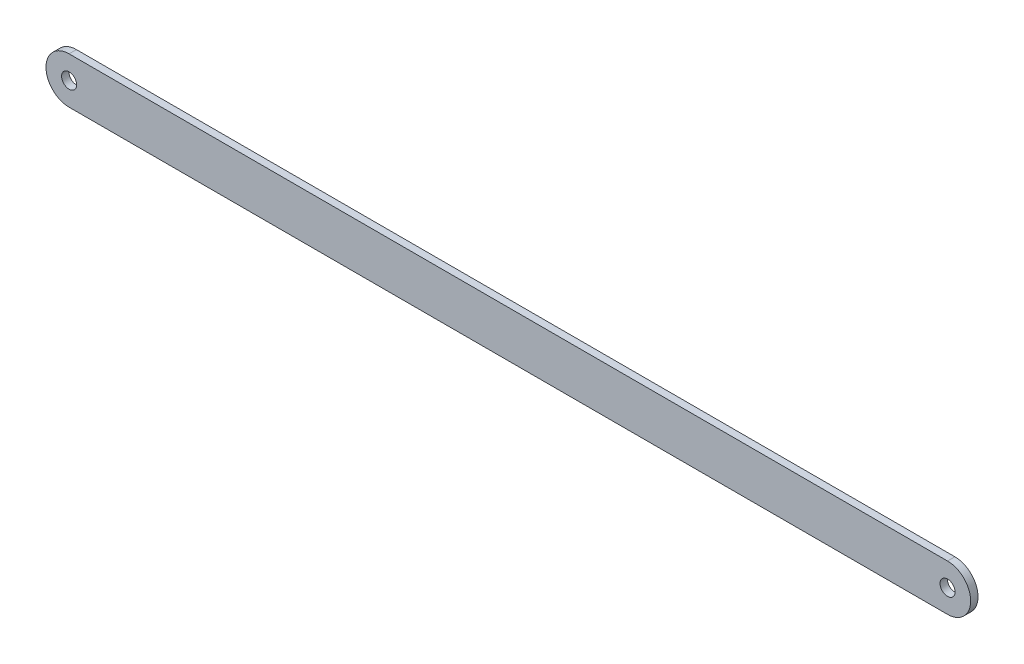
ISO-10303-21;
HEADER;
FILE_DESCRIPTION(('STEP AP214'),'2;1');
FILE_NAME('part.step','',(''),(''),'','','');
FILE_SCHEMA(('AUTOMOTIVE_DESIGN { 1 0 10303 214 1 1 1 1 }'));
ENDSEC;
DATA;
#1=APPLICATION_CONTEXT('core data for automotive mechanical design processes');
#2=APPLICATION_PROTOCOL_DEFINITION('international standard','automotive_design',2000,#1);
#3=PRODUCT_CONTEXT('',#1,'mechanical');
#4=PRODUCT('Part','Part','',(#3));
#5=PRODUCT_RELATED_PRODUCT_CATEGORY('part','',(#4));
#6=PRODUCT_DEFINITION_FORMATION('','',#4);
#7=PRODUCT_DEFINITION_CONTEXT('part definition',#1,'design');
#8=PRODUCT_DEFINITION('design','',#6,#7);
#9=PRODUCT_DEFINITION_SHAPE('','',#8);
#10=(LENGTH_UNIT() NAMED_UNIT(*) SI_UNIT(.MILLI.,.METRE.));
#11=(NAMED_UNIT(*) PLANE_ANGLE_UNIT() SI_UNIT($,.RADIAN.));
#12=(NAMED_UNIT(*) SI_UNIT($,.STERADIAN.) SOLID_ANGLE_UNIT());
#13=UNCERTAINTY_MEASURE_WITH_UNIT(LENGTH_MEASURE(1.E-05),#10,'distance_accuracy_value','');
#14=(GEOMETRIC_REPRESENTATION_CONTEXT(3) GLOBAL_UNCERTAINTY_ASSIGNED_CONTEXT((#13)) GLOBAL_UNIT_ASSIGNED_CONTEXT((#10,
#11,#12)) REPRESENTATION_CONTEXT('',''));
#15=CARTESIAN_POINT('',(0.,0.,0.));
#16=DIRECTION('',(0.,0.,1.));
#17=DIRECTION('',(1.,0.,0.));
#18=AXIS2_PLACEMENT_3D('',#15,#16,#17);
#19=CARTESIAN_POINT('',(0.,0.,3.175));
#20=DIRECTION('',(0.,0.,1.));
#21=DIRECTION('',(1.,0.,0.));
#22=AXIS2_PLACEMENT_3D('',#19,#20,#21);
#23=PLANE('',#22);
#24=CARTESIAN_POINT('',(0.,0.,3.175));
#25=DIRECTION('',(0.,0.,1.));
#26=DIRECTION('',(1.,0.,0.));
#27=AXIS2_PLACEMENT_3D('',#24,#25,#26);
#28=CIRCLE('',#27,3.25);
#29=CARTESIAN_POINT('',(3.25,0.,3.175));
#30=VERTEX_POINT('',#29);
#31=EDGE_CURVE('E112',#30,#30,#28,.T.);
#32=ORIENTED_EDGE('',*,*,#31,.F.);
#33=EDGE_LOOP('',(#32));
#34=FACE_BOUND('',#33,.T.);
#35=CARTESIAN_POINT('',(0.,0.,3.175));
#36=DIRECTION('',(0.,0.,1.));
#37=DIRECTION('',(1.,0.,0.));
#38=AXIS2_PLACEMENT_3D('',#35,#36,#37);
#39=CIRCLE('',#38,10.);
#40=CARTESIAN_POINT('',(0.,10.,3.175));
#41=VERTEX_POINT('',#40);
#42=CARTESIAN_POINT('',(0.,-10.,3.175));
#43=VERTEX_POINT('',#42);
#44=EDGE_CURVE('E92',#41,#43,#39,.T.);
#45=ORIENTED_EDGE('',*,*,#44,.T.);
#46=DIRECTION('',(1.,0.,0.));
#47=VECTOR('',#46,1.);
#48=CARTESIAN_POINT('',(0.,-10.,3.175));
#49=LINE('',#48,#47);
#50=CARTESIAN_POINT('',(380.,-10.,3.175));
#51=VERTEX_POINT('',#50);
#52=EDGE_CURVE('E87',#43,#51,#49,.T.);
#53=ORIENTED_EDGE('',*,*,#52,.T.);
#54=CARTESIAN_POINT('',(380.,0.,3.175));
#55=DIRECTION('',(0.,0.,1.));
#56=DIRECTION('',(1.,0.,0.));
#57=AXIS2_PLACEMENT_3D('',#54,#55,#56);
#58=CIRCLE('',#57,10.);
#59=CARTESIAN_POINT('',(380.,10.,3.175));
#60=VERTEX_POINT('',#59);
#61=EDGE_CURVE('E90',#51,#60,#58,.T.);
#62=ORIENTED_EDGE('',*,*,#61,.T.);
#63=DIRECTION('',(-1.,0.,0.));
#64=VECTOR('',#63,1.);
#65=CARTESIAN_POINT('',(0.,10.,3.175));
#66=LINE('',#65,#64);
#67=EDGE_CURVE('E57',#60,#41,#66,.T.);
#68=ORIENTED_EDGE('',*,*,#67,.T.);
#69=EDGE_LOOP('',(#45,#53,#62,#68));
#70=FACE_BOUND('',#69,.T.);
#71=CARTESIAN_POINT('',(380.,0.,3.175));
#72=DIRECTION('',(0.,0.,1.));
#73=DIRECTION('',(1.,0.,0.));
#74=AXIS2_PLACEMENT_3D('',#71,#72,#73);
#75=CIRCLE('',#74,3.25000000000001);
#76=CARTESIAN_POINT('',(383.25,0.,3.175));
#77=VERTEX_POINT('',#76);
#78=EDGE_CURVE('E134',#77,#77,#75,.T.);
#79=ORIENTED_EDGE('',*,*,#78,.F.);
#80=EDGE_LOOP('',(#79));
#81=FACE_BOUND('',#80,.T.);
#82=ADVANCED_FACE('F39',(#34,#70,#81),#23,.T.);
#83=CARTESIAN_POINT('',(0.,0.,0.));
#84=DIRECTION('',(0.,0.,1.));
#85=DIRECTION('',(1.,0.,0.));
#86=AXIS2_PLACEMENT_3D('',#83,#84,#85);
#87=PLANE('',#86);
#88=CARTESIAN_POINT('',(0.,0.,0.));
#89=DIRECTION('',(0.,0.,1.));
#90=DIRECTION('',(1.,0.,0.));
#91=AXIS2_PLACEMENT_3D('',#88,#89,#90);
#92=CIRCLE('',#91,10.);
#93=CARTESIAN_POINT('',(0.,10.,0.));
#94=VERTEX_POINT('',#93);
#95=CARTESIAN_POINT('',(0.,-10.,0.));
#96=VERTEX_POINT('',#95);
#97=EDGE_CURVE('E108',#94,#96,#92,.T.);
#98=ORIENTED_EDGE('',*,*,#97,.F.);
#99=DIRECTION('',(-1.,0.,0.));
#100=VECTOR('',#99,1.);
#101=CARTESIAN_POINT('',(0.,10.,0.));
#102=LINE('',#101,#100);
#103=CARTESIAN_POINT('',(380.,10.,0.));
#104=VERTEX_POINT('',#103);
#105=EDGE_CURVE('E80',#104,#94,#102,.T.);
#106=ORIENTED_EDGE('',*,*,#105,.F.);
#107=CARTESIAN_POINT('',(380.,0.,0.));
#108=DIRECTION('',(0.,0.,1.));
#109=DIRECTION('',(1.,0.,0.));
#110=AXIS2_PLACEMENT_3D('',#107,#108,#109);
#111=CIRCLE('',#110,10.);
#112=CARTESIAN_POINT('',(380.,-10.,0.));
#113=VERTEX_POINT('',#112);
#114=EDGE_CURVE('E74',#113,#104,#111,.T.);
#115=ORIENTED_EDGE('',*,*,#114,.F.);
#116=DIRECTION('',(1.,0.,0.));
#117=VECTOR('',#116,1.);
#118=CARTESIAN_POINT('',(0.,-10.,0.));
#119=LINE('',#118,#117);
#120=EDGE_CURVE('E97',#96,#113,#119,.T.);
#121=ORIENTED_EDGE('',*,*,#120,.F.);
#122=EDGE_LOOP('',(#98,#106,#115,#121));
#123=FACE_BOUND('',#122,.T.);
#124=CARTESIAN_POINT('',(0.,0.,0.));
#125=DIRECTION('',(0.,0.,1.));
#126=DIRECTION('',(1.,0.,0.));
#127=AXIS2_PLACEMENT_3D('',#124,#125,#126);
#128=CIRCLE('',#127,3.25);
#129=CARTESIAN_POINT('',(3.25,0.,0.));
#130=VERTEX_POINT('',#129);
#131=EDGE_CURVE('E130',#130,#130,#128,.T.);
#132=ORIENTED_EDGE('',*,*,#131,.T.);
#133=EDGE_LOOP('',(#132));
#134=FACE_BOUND('',#133,.T.);
#135=CARTESIAN_POINT('',(380.,0.,0.));
#136=DIRECTION('',(0.,0.,1.));
#137=DIRECTION('',(1.,0.,0.));
#138=AXIS2_PLACEMENT_3D('',#135,#136,#137);
#139=CIRCLE('',#138,3.25000000000001);
#140=CARTESIAN_POINT('',(383.25,0.,0.));
#141=VERTEX_POINT('',#140);
#142=EDGE_CURVE('E138',#141,#141,#139,.T.);
#143=ORIENTED_EDGE('',*,*,#142,.T.);
#144=EDGE_LOOP('',(#143));
#145=FACE_BOUND('',#144,.T.);
#146=ADVANCED_FACE('F125',(#123,#134,#145),#87,.F.);
#147=CARTESIAN_POINT('',(0.,0.,3.175));
#148=DIRECTION('',(0.,0.,-1.));
#149=DIRECTION('',(-1.,0.,0.));
#150=AXIS2_PLACEMENT_3D('',#147,#148,#149);
#151=CYLINDRICAL_SURFACE('',#150,10.);
#152=ORIENTED_EDGE('',*,*,#97,.T.);
#153=DIRECTION('',(0.,0.,-1.));
#154=VECTOR('',#153,1.);
#155=CARTESIAN_POINT('',(0.,-10.,3.175));
#156=LINE('',#155,#154);
#157=EDGE_CURVE('E11',#43,#96,#156,.T.);
#158=ORIENTED_EDGE('',*,*,#157,.F.);
#159=ORIENTED_EDGE('',*,*,#44,.F.);
#160=DIRECTION('',(0.,0.,-1.));
#161=VECTOR('',#160,1.);
#162=CARTESIAN_POINT('',(0.,10.,3.175));
#163=LINE('',#162,#161);
#164=EDGE_CURVE('E104',#41,#94,#163,.T.);
#165=ORIENTED_EDGE('',*,*,#164,.T.);
#166=EDGE_LOOP('',(#152,#158,#159,#165));
#167=FACE_BOUND('',#166,.T.);
#168=ADVANCED_FACE('F41',(#167),#151,.T.);
#169=CARTESIAN_POINT('',(0.,-10.,3.175));
#170=DIRECTION('',(0.,1.,0.));
#171=DIRECTION('',(0.,0.,1.));
#172=AXIS2_PLACEMENT_3D('',#169,#170,#171);
#173=PLANE('',#172);
#174=ORIENTED_EDGE('',*,*,#120,.T.);
#175=DIRECTION('',(0.,0.,-1.));
#176=VECTOR('',#175,1.);
#177=CARTESIAN_POINT('',(380.,-10.,3.175));
#178=LINE('',#177,#176);
#179=EDGE_CURVE('E49',#51,#113,#178,.T.);
#180=ORIENTED_EDGE('',*,*,#179,.F.);
#181=ORIENTED_EDGE('',*,*,#52,.F.);
#182=ORIENTED_EDGE('',*,*,#157,.T.);
#183=EDGE_LOOP('',(#174,#180,#181,#182));
#184=FACE_BOUND('',#183,.T.);
#185=ADVANCED_FACE('F96',(#184),#173,.F.);
#186=CARTESIAN_POINT('',(380.,0.,3.175));
#187=DIRECTION('',(0.,0.,-1.));
#188=DIRECTION('',(-1.,0.,0.));
#189=AXIS2_PLACEMENT_3D('',#186,#187,#188);
#190=CYLINDRICAL_SURFACE('',#189,10.);
#191=ORIENTED_EDGE('',*,*,#114,.T.);
#192=DIRECTION('',(0.,0.,-1.));
#193=VECTOR('',#192,1.);
#194=CARTESIAN_POINT('',(380.,10.,3.175));
#195=LINE('',#194,#193);
#196=EDGE_CURVE('E99',#60,#104,#195,.T.);
#197=ORIENTED_EDGE('',*,*,#196,.F.);
#198=ORIENTED_EDGE('',*,*,#61,.F.);
#199=ORIENTED_EDGE('',*,*,#179,.T.);
#200=EDGE_LOOP('',(#191,#197,#198,#199));
#201=FACE_BOUND('',#200,.T.);
#202=ADVANCED_FACE('F100',(#201),#190,.T.);
#203=CARTESIAN_POINT('',(0.,10.,3.175));
#204=DIRECTION('',(0.,-1.,0.));
#205=DIRECTION('',(0.,0.,-1.));
#206=AXIS2_PLACEMENT_3D('',#203,#204,#205);
#207=PLANE('',#206);
#208=ORIENTED_EDGE('',*,*,#105,.T.);
#209=ORIENTED_EDGE('',*,*,#164,.F.);
#210=ORIENTED_EDGE('',*,*,#67,.F.);
#211=ORIENTED_EDGE('',*,*,#196,.T.);
#212=EDGE_LOOP('',(#208,#209,#210,#211));
#213=FACE_BOUND('',#212,.T.);
#214=ADVANCED_FACE('F122',(#213),#207,.F.);
#215=CARTESIAN_POINT('',(0.,0.,3.175));
#216=DIRECTION('',(0.,0.,-1.));
#217=DIRECTION('',(-1.,0.,0.));
#218=AXIS2_PLACEMENT_3D('',#215,#216,#217);
#219=CYLINDRICAL_SURFACE('',#218,3.25);
#220=ORIENTED_EDGE('',*,*,#31,.T.);
#221=EDGE_LOOP('',(#220));
#222=FACE_BOUND('',#221,.T.);
#223=ORIENTED_EDGE('',*,*,#131,.F.);
#224=EDGE_LOOP('',(#223));
#225=FACE_BOUND('',#224,.T.);
#226=ADVANCED_FACE('F157',(#222,#225),#219,.F.);
#227=CARTESIAN_POINT('',(380.,0.,3.175));
#228=DIRECTION('',(0.,0.,-1.));
#229=DIRECTION('',(-1.,0.,0.));
#230=AXIS2_PLACEMENT_3D('',#227,#228,#229);
#231=CYLINDRICAL_SURFACE('',#230,3.25000000000001);
#232=ORIENTED_EDGE('',*,*,#78,.T.);
#233=EDGE_LOOP('',(#232));
#234=FACE_BOUND('',#233,.T.);
#235=ORIENTED_EDGE('',*,*,#142,.F.);
#236=EDGE_LOOP('',(#235));
#237=FACE_BOUND('',#236,.T.);
#238=ADVANCED_FACE('F146',(#234,#237),#231,.F.);
#239=CLOSED_SHELL('',(#82,#146,#168,#185,#202,#214,#226,#238));
#240=MANIFOLD_SOLID_BREP('B2',#239);
#241=ADVANCED_BREP_SHAPE_REPRESENTATION('',(#18,#240),#14);
#242=SHAPE_DEFINITION_REPRESENTATION(#9,#241);
ENDSEC;
END-ISO-10303-21;
